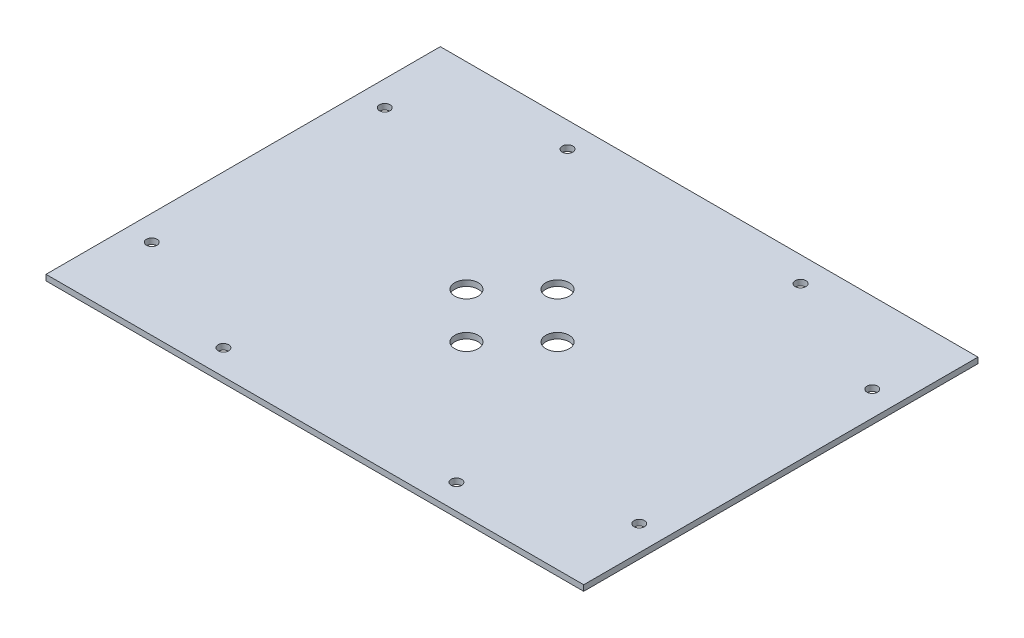
ISO-10303-21;
HEADER;
FILE_DESCRIPTION(('STEP AP214'),'2;1');
FILE_NAME('part.step','',(''),(''),'','','');
FILE_SCHEMA(('AUTOMOTIVE_DESIGN { 1 0 10303 214 1 1 1 1 }'));
ENDSEC;
DATA;
#1=APPLICATION_CONTEXT('core data for automotive mechanical design processes');
#2=APPLICATION_PROTOCOL_DEFINITION('international standard','automotive_design',2000,#1);
#3=PRODUCT_CONTEXT('',#1,'mechanical');
#4=PRODUCT('Part','Part','',(#3));
#5=PRODUCT_RELATED_PRODUCT_CATEGORY('part','',(#4));
#6=PRODUCT_DEFINITION_FORMATION('','',#4);
#7=PRODUCT_DEFINITION_CONTEXT('part definition',#1,'design');
#8=PRODUCT_DEFINITION('design','',#6,#7);
#9=PRODUCT_DEFINITION_SHAPE('','',#8);
#10=(LENGTH_UNIT() NAMED_UNIT(*) SI_UNIT(.MILLI.,.METRE.));
#11=(NAMED_UNIT(*) PLANE_ANGLE_UNIT() SI_UNIT($,.RADIAN.));
#12=(NAMED_UNIT(*) SI_UNIT($,.STERADIAN.) SOLID_ANGLE_UNIT());
#13=UNCERTAINTY_MEASURE_WITH_UNIT(LENGTH_MEASURE(1.E-05),#10,'distance_accuracy_value','');
#14=(GEOMETRIC_REPRESENTATION_CONTEXT(3) GLOBAL_UNCERTAINTY_ASSIGNED_CONTEXT((#13)) GLOBAL_UNIT_ASSIGNED_CONTEXT((#10,
#11,#12)) REPRESENTATION_CONTEXT('',''));
#15=CARTESIAN_POINT('',(0.,0.,0.));
#16=DIRECTION('',(0.,0.,1.));
#17=DIRECTION('',(1.,0.,0.));
#18=AXIS2_PLACEMENT_3D('',#15,#16,#17);
#19=CARTESIAN_POINT('',(75.,1.6,0.));
#20=DIRECTION('',(1.,0.,0.));
#21=DIRECTION('',(0.,0.,-1.));
#22=AXIS2_PLACEMENT_3D('',#19,#20,#21);
#23=PLANE('',#22);
#24=DIRECTION('',(0.,0.,1.));
#25=VECTOR('',#24,1.);
#26=CARTESIAN_POINT('',(75.,0.,0.));
#27=LINE('',#26,#25);
#28=CARTESIAN_POINT('',(75.,0.,-55.));
#29=VERTEX_POINT('',#28);
#30=CARTESIAN_POINT('',(75.,0.,55.));
#31=VERTEX_POINT('',#30);
#32=EDGE_CURVE('E166',#29,#31,#27,.T.);
#33=ORIENTED_EDGE('',*,*,#32,.F.);
#34=DIRECTION('',(0.,-1.,0.));
#35=VECTOR('',#34,1.);
#36=CARTESIAN_POINT('',(75.,1.6,-55.));
#37=LINE('',#36,#35);
#38=CARTESIAN_POINT('',(75.,1.6,-55.));
#39=VERTEX_POINT('',#38);
#40=EDGE_CURVE('E11',#39,#29,#37,.T.);
#41=ORIENTED_EDGE('',*,*,#40,.F.);
#42=DIRECTION('',(0.,0.,1.));
#43=VECTOR('',#42,1.);
#44=CARTESIAN_POINT('',(75.,1.6,0.));
#45=LINE('',#44,#43);
#46=CARTESIAN_POINT('',(75.,1.6,55.));
#47=VERTEX_POINT('',#46);
#48=EDGE_CURVE('E108',#39,#47,#45,.T.);
#49=ORIENTED_EDGE('',*,*,#48,.T.);
#50=DIRECTION('',(0.,-1.,0.));
#51=VECTOR('',#50,1.);
#52=CARTESIAN_POINT('',(75.,1.6,55.));
#53=LINE('',#52,#51);
#54=EDGE_CURVE('E85',#47,#31,#53,.T.);
#55=ORIENTED_EDGE('',*,*,#54,.T.);
#56=EDGE_LOOP('',(#33,#41,#49,#55));
#57=FACE_BOUND('',#56,.T.);
#58=ADVANCED_FACE('F44',(#57),#23,.T.);
#59=CARTESIAN_POINT('',(0.,1.6,-55.));
#60=DIRECTION('',(0.,0.,-1.));
#61=DIRECTION('',(-1.,0.,0.));
#62=AXIS2_PLACEMENT_3D('',#59,#60,#61);
#63=PLANE('',#62);
#64=DIRECTION('',(1.,0.,0.));
#65=VECTOR('',#64,1.);
#66=CARTESIAN_POINT('',(0.,0.,-55.));
#67=LINE('',#66,#65);
#68=CARTESIAN_POINT('',(-75.,0.,-55.));
#69=VERTEX_POINT('',#68);
#70=EDGE_CURVE('E97',#69,#29,#67,.T.);
#71=ORIENTED_EDGE('',*,*,#70,.F.);
#72=DIRECTION('',(0.,-1.,0.));
#73=VECTOR('',#72,1.);
#74=CARTESIAN_POINT('',(-75.,1.6,-55.));
#75=LINE('',#74,#73);
#76=CARTESIAN_POINT('',(-75.,1.6,-55.));
#77=VERTEX_POINT('',#76);
#78=EDGE_CURVE('E54',#77,#69,#75,.T.);
#79=ORIENTED_EDGE('',*,*,#78,.F.);
#80=DIRECTION('',(1.,0.,0.));
#81=VECTOR('',#80,1.);
#82=CARTESIAN_POINT('',(0.,1.6,-55.));
#83=LINE('',#82,#81);
#84=EDGE_CURVE('E95',#77,#39,#83,.T.);
#85=ORIENTED_EDGE('',*,*,#84,.T.);
#86=ORIENTED_EDGE('',*,*,#40,.T.);
#87=EDGE_LOOP('',(#71,#79,#85,#86));
#88=FACE_BOUND('',#87,.T.);
#89=ADVANCED_FACE('F93',(#88),#63,.T.);
#90=CARTESIAN_POINT('',(-75.,1.6,0.));
#91=DIRECTION('',(1.,0.,0.));
#92=DIRECTION('',(0.,0.,-1.));
#93=AXIS2_PLACEMENT_3D('',#90,#91,#92);
#94=PLANE('',#93);
#95=DIRECTION('',(0.,0.,1.));
#96=VECTOR('',#95,1.);
#97=CARTESIAN_POINT('',(-75.,0.,0.));
#98=LINE('',#97,#96);
#99=CARTESIAN_POINT('',(-75.,0.,55.));
#100=VERTEX_POINT('',#99);
#101=EDGE_CURVE('E171',#69,#100,#98,.T.);
#102=ORIENTED_EDGE('',*,*,#101,.T.);
#103=DIRECTION('',(0.,-1.,0.));
#104=VECTOR('',#103,1.);
#105=CARTESIAN_POINT('',(-75.,1.6,55.));
#106=LINE('',#105,#104);
#107=CARTESIAN_POINT('',(-75.,1.6,55.));
#108=VERTEX_POINT('',#107);
#109=EDGE_CURVE('E101',#108,#100,#106,.T.);
#110=ORIENTED_EDGE('',*,*,#109,.F.);
#111=DIRECTION('',(0.,0.,1.));
#112=VECTOR('',#111,1.);
#113=CARTESIAN_POINT('',(-75.,1.6,0.));
#114=LINE('',#113,#112);
#115=EDGE_CURVE('E103',#77,#108,#114,.T.);
#116=ORIENTED_EDGE('',*,*,#115,.F.);
#117=ORIENTED_EDGE('',*,*,#78,.T.);
#118=EDGE_LOOP('',(#102,#110,#116,#117));
#119=FACE_BOUND('',#118,.T.);
#120=ADVANCED_FACE('F104',(#119),#94,.F.);
#121=CARTESIAN_POINT('',(0.,1.6,-12.7));
#122=DIRECTION('',(0.,-1.,0.));
#123=DIRECTION('',(0.,0.,-1.));
#124=AXIS2_PLACEMENT_3D('',#121,#122,#123);
#125=CYLINDRICAL_SURFACE('',#124,3.2639);
#126=CARTESIAN_POINT('',(0.,1.6,-12.7));
#127=DIRECTION('',(0.,1.,0.));
#128=DIRECTION('',(0.,0.,1.));
#129=AXIS2_PLACEMENT_3D('',#126,#127,#128);
#130=CIRCLE('',#129,3.2639);
#131=CARTESIAN_POINT('',(0.,1.6,-9.4361));
#132=VERTEX_POINT('',#131);
#133=EDGE_CURVE('E112',#132,#132,#130,.T.);
#134=ORIENTED_EDGE('',*,*,#133,.T.);
#135=EDGE_LOOP('',(#134));
#136=FACE_BOUND('',#135,.T.);
#137=CARTESIAN_POINT('',(0.,0.,-12.7));
#138=DIRECTION('',(0.,1.,0.));
#139=DIRECTION('',(0.,0.,1.));
#140=AXIS2_PLACEMENT_3D('',#137,#138,#139);
#141=CIRCLE('',#140,3.2639);
#142=CARTESIAN_POINT('',(0.,0.,-9.4361));
#143=VERTEX_POINT('',#142);
#144=EDGE_CURVE('E162',#143,#143,#141,.T.);
#145=ORIENTED_EDGE('',*,*,#144,.F.);
#146=EDGE_LOOP('',(#145));
#147=FACE_BOUND('',#146,.T.);
#148=ADVANCED_FACE('F191',(#136,#147),#125,.F.);
#149=CARTESIAN_POINT('',(12.7,1.6,0.));
#150=DIRECTION('',(0.,-1.,0.));
#151=DIRECTION('',(0.,0.,-1.));
#152=AXIS2_PLACEMENT_3D('',#149,#150,#151);
#153=CYLINDRICAL_SURFACE('',#152,3.2639);
#154=CARTESIAN_POINT('',(12.7,1.6,0.));
#155=DIRECTION('',(0.,1.,0.));
#156=DIRECTION('',(0.,0.,1.));
#157=AXIS2_PLACEMENT_3D('',#154,#155,#156);
#158=CIRCLE('',#157,3.2639);
#159=CARTESIAN_POINT('',(12.7,1.6,3.2639));
#160=VERTEX_POINT('',#159);
#161=EDGE_CURVE('E495',#160,#160,#158,.T.);
#162=ORIENTED_EDGE('',*,*,#161,.T.);
#163=EDGE_LOOP('',(#162));
#164=FACE_BOUND('',#163,.T.);
#165=CARTESIAN_POINT('',(12.7,0.,0.));
#166=DIRECTION('',(0.,1.,0.));
#167=DIRECTION('',(0.,0.,1.));
#168=AXIS2_PLACEMENT_3D('',#165,#166,#167);
#169=CIRCLE('',#168,3.2639);
#170=CARTESIAN_POINT('',(12.7,0.,3.2639));
#171=VERTEX_POINT('',#170);
#172=EDGE_CURVE('E158',#171,#171,#169,.T.);
#173=ORIENTED_EDGE('',*,*,#172,.F.);
#174=EDGE_LOOP('',(#173));
#175=FACE_BOUND('',#174,.T.);
#176=ADVANCED_FACE('F194',(#164,#175),#153,.F.);
#177=CARTESIAN_POINT('',(0.,1.6,12.7));
#178=DIRECTION('',(0.,-1.,0.));
#179=DIRECTION('',(0.,0.,-1.));
#180=AXIS2_PLACEMENT_3D('',#177,#178,#179);
#181=CYLINDRICAL_SURFACE('',#180,3.2639);
#182=CARTESIAN_POINT('',(0.,1.6,12.7));
#183=DIRECTION('',(0.,1.,0.));
#184=DIRECTION('',(0.,0.,1.));
#185=AXIS2_PLACEMENT_3D('',#182,#183,#184);
#186=CIRCLE('',#185,3.2639);
#187=CARTESIAN_POINT('',(0.,1.6,15.9639));
#188=VERTEX_POINT('',#187);
#189=EDGE_CURVE('E491',#188,#188,#186,.T.);
#190=ORIENTED_EDGE('',*,*,#189,.T.);
#191=EDGE_LOOP('',(#190));
#192=FACE_BOUND('',#191,.T.);
#193=CARTESIAN_POINT('',(0.,0.,12.7));
#194=DIRECTION('',(0.,1.,0.));
#195=DIRECTION('',(0.,0.,1.));
#196=AXIS2_PLACEMENT_3D('',#193,#194,#195);
#197=CIRCLE('',#196,3.2639);
#198=CARTESIAN_POINT('',(0.,0.,15.9639));
#199=VERTEX_POINT('',#198);
#200=EDGE_CURVE('E154',#199,#199,#197,.T.);
#201=ORIENTED_EDGE('',*,*,#200,.F.);
#202=EDGE_LOOP('',(#201));
#203=FACE_BOUND('',#202,.T.);
#204=ADVANCED_FACE('F198',(#192,#203),#181,.F.);
#205=CARTESIAN_POINT('',(-12.7,1.6,0.));
#206=DIRECTION('',(0.,-1.,0.));
#207=DIRECTION('',(0.,0.,-1.));
#208=AXIS2_PLACEMENT_3D('',#205,#206,#207);
#209=CYLINDRICAL_SURFACE('',#208,3.2639);
#210=CARTESIAN_POINT('',(-12.7,1.6,0.));
#211=DIRECTION('',(0.,1.,0.));
#212=DIRECTION('',(0.,0.,1.));
#213=AXIS2_PLACEMENT_3D('',#210,#211,#212);
#214=CIRCLE('',#213,3.2639);
#215=CARTESIAN_POINT('',(-12.7,1.6,3.2639));
#216=VERTEX_POINT('',#215);
#217=EDGE_CURVE('E487',#216,#216,#214,.T.);
#218=ORIENTED_EDGE('',*,*,#217,.T.);
#219=EDGE_LOOP('',(#218));
#220=FACE_BOUND('',#219,.T.);
#221=CARTESIAN_POINT('',(-12.7,0.,0.));
#222=DIRECTION('',(0.,1.,0.));
#223=DIRECTION('',(0.,0.,1.));
#224=AXIS2_PLACEMENT_3D('',#221,#222,#223);
#225=CIRCLE('',#224,3.2639);
#226=CARTESIAN_POINT('',(-12.7,0.,3.2639));
#227=VERTEX_POINT('',#226);
#228=EDGE_CURVE('E150',#227,#227,#225,.T.);
#229=ORIENTED_EDGE('',*,*,#228,.F.);
#230=EDGE_LOOP('',(#229));
#231=FACE_BOUND('',#230,.T.);
#232=ADVANCED_FACE('F202',(#220,#231),#209,.F.);
#233=CARTESIAN_POINT('',(-32.5,1.6,-48.));
#234=DIRECTION('',(0.,-1.,0.));
#235=DIRECTION('',(0.,0.,-1.));
#236=AXIS2_PLACEMENT_3D('',#233,#234,#235);
#237=CYLINDRICAL_SURFACE('',#236,1.4732);
#238=CARTESIAN_POINT('',(-32.5,1.6,-48.));
#239=DIRECTION('',(0.,1.,0.));
#240=DIRECTION('',(0.,0.,1.));
#241=AXIS2_PLACEMENT_3D('',#238,#239,#240);
#242=CIRCLE('',#241,1.4732);
#243=CARTESIAN_POINT('',(-32.5,1.6,-46.5268));
#244=VERTEX_POINT('',#243);
#245=EDGE_CURVE('E483',#244,#244,#242,.T.);
#246=ORIENTED_EDGE('',*,*,#245,.T.);
#247=EDGE_LOOP('',(#246));
#248=FACE_BOUND('',#247,.T.);
#249=CARTESIAN_POINT('',(-32.5,0.,-48.));
#250=DIRECTION('',(0.,1.,0.));
#251=DIRECTION('',(0.,0.,1.));
#252=AXIS2_PLACEMENT_3D('',#249,#250,#251);
#253=CIRCLE('',#252,1.4732);
#254=CARTESIAN_POINT('',(-32.5,0.,-46.5268));
#255=VERTEX_POINT('',#254);
#256=EDGE_CURVE('E146',#255,#255,#253,.T.);
#257=ORIENTED_EDGE('',*,*,#256,.F.);
#258=EDGE_LOOP('',(#257));
#259=FACE_BOUND('',#258,.T.);
#260=ADVANCED_FACE('F206',(#248,#259),#237,.F.);
#261=CARTESIAN_POINT('',(32.5,1.6,-48.));
#262=DIRECTION('',(0.,-1.,0.));
#263=DIRECTION('',(0.,0.,-1.));
#264=AXIS2_PLACEMENT_3D('',#261,#262,#263);
#265=CYLINDRICAL_SURFACE('',#264,1.4732);
#266=CARTESIAN_POINT('',(32.5,1.6,-48.));
#267=DIRECTION('',(0.,1.,0.));
#268=DIRECTION('',(0.,0.,1.));
#269=AXIS2_PLACEMENT_3D('',#266,#267,#268);
#270=CIRCLE('',#269,1.4732);
#271=CARTESIAN_POINT('',(32.5,1.6,-46.5268));
#272=VERTEX_POINT('',#271);
#273=EDGE_CURVE('E479',#272,#272,#270,.T.);
#274=ORIENTED_EDGE('',*,*,#273,.T.);
#275=EDGE_LOOP('',(#274));
#276=FACE_BOUND('',#275,.T.);
#277=CARTESIAN_POINT('',(32.5,0.,-48.));
#278=DIRECTION('',(0.,1.,0.));
#279=DIRECTION('',(0.,0.,1.));
#280=AXIS2_PLACEMENT_3D('',#277,#278,#279);
#281=CIRCLE('',#280,1.4732);
#282=CARTESIAN_POINT('',(32.5,0.,-46.5268));
#283=VERTEX_POINT('',#282);
#284=EDGE_CURVE('E142',#283,#283,#281,.T.);
#285=ORIENTED_EDGE('',*,*,#284,.F.);
#286=EDGE_LOOP('',(#285));
#287=FACE_BOUND('',#286,.T.);
#288=ADVANCED_FACE('F210',(#276,#287),#265,.F.);
#289=CARTESIAN_POINT('',(32.5,1.6,48.));
#290=DIRECTION('',(0.,-1.,0.));
#291=DIRECTION('',(0.,0.,-1.));
#292=AXIS2_PLACEMENT_3D('',#289,#290,#291);
#293=CYLINDRICAL_SURFACE('',#292,1.4732);
#294=CARTESIAN_POINT('',(32.5,1.6,48.));
#295=DIRECTION('',(0.,1.,0.));
#296=DIRECTION('',(0.,0.,1.));
#297=AXIS2_PLACEMENT_3D('',#294,#295,#296);
#298=CIRCLE('',#297,1.4732);
#299=CARTESIAN_POINT('',(32.5,1.6,49.4732));
#300=VERTEX_POINT('',#299);
#301=EDGE_CURVE('E475',#300,#300,#298,.T.);
#302=ORIENTED_EDGE('',*,*,#301,.T.);
#303=EDGE_LOOP('',(#302));
#304=FACE_BOUND('',#303,.T.);
#305=CARTESIAN_POINT('',(32.5,0.,48.));
#306=DIRECTION('',(0.,1.,0.));
#307=DIRECTION('',(0.,0.,1.));
#308=AXIS2_PLACEMENT_3D('',#305,#306,#307);
#309=CIRCLE('',#308,1.4732);
#310=CARTESIAN_POINT('',(32.5,0.,49.4732));
#311=VERTEX_POINT('',#310);
#312=EDGE_CURVE('E138',#311,#311,#309,.T.);
#313=ORIENTED_EDGE('',*,*,#312,.F.);
#314=EDGE_LOOP('',(#313));
#315=FACE_BOUND('',#314,.T.);
#316=ADVANCED_FACE('F214',(#304,#315),#293,.F.);
#317=CARTESIAN_POINT('',(-32.5,1.6,48.));
#318=DIRECTION('',(0.,-1.,0.));
#319=DIRECTION('',(0.,0.,-1.));
#320=AXIS2_PLACEMENT_3D('',#317,#318,#319);
#321=CYLINDRICAL_SURFACE('',#320,1.4732);
#322=CARTESIAN_POINT('',(-32.5,1.6,48.));
#323=DIRECTION('',(0.,1.,0.));
#324=DIRECTION('',(0.,0.,1.));
#325=AXIS2_PLACEMENT_3D('',#322,#323,#324);
#326=CIRCLE('',#325,1.4732);
#327=CARTESIAN_POINT('',(-32.5,1.6,49.4732));
#328=VERTEX_POINT('',#327);
#329=EDGE_CURVE('E471',#328,#328,#326,.T.);
#330=ORIENTED_EDGE('',*,*,#329,.T.);
#331=EDGE_LOOP('',(#330));
#332=FACE_BOUND('',#331,.T.);
#333=CARTESIAN_POINT('',(-32.5,0.,48.));
#334=DIRECTION('',(0.,1.,0.));
#335=DIRECTION('',(0.,0.,1.));
#336=AXIS2_PLACEMENT_3D('',#333,#334,#335);
#337=CIRCLE('',#336,1.4732);
#338=CARTESIAN_POINT('',(-32.5,0.,49.4732));
#339=VERTEX_POINT('',#338);
#340=EDGE_CURVE('E134',#339,#339,#337,.T.);
#341=ORIENTED_EDGE('',*,*,#340,.F.);
#342=EDGE_LOOP('',(#341));
#343=FACE_BOUND('',#342,.T.);
#344=ADVANCED_FACE('F218',(#332,#343),#321,.F.);
#345=CARTESIAN_POINT('',(-68.,1.6,-32.5));
#346=DIRECTION('',(0.,-1.,0.));
#347=DIRECTION('',(0.,0.,-1.));
#348=AXIS2_PLACEMENT_3D('',#345,#346,#347);
#349=CYLINDRICAL_SURFACE('',#348,1.4732);
#350=CARTESIAN_POINT('',(-68.,1.6,-32.5));
#351=DIRECTION('',(0.,1.,0.));
#352=DIRECTION('',(0.,0.,1.));
#353=AXIS2_PLACEMENT_3D('',#350,#351,#352);
#354=CIRCLE('',#353,1.4732);
#355=CARTESIAN_POINT('',(-68.,1.6,-31.0268));
#356=VERTEX_POINT('',#355);
#357=EDGE_CURVE('E467',#356,#356,#354,.T.);
#358=ORIENTED_EDGE('',*,*,#357,.T.);
#359=EDGE_LOOP('',(#358));
#360=FACE_BOUND('',#359,.T.);
#361=CARTESIAN_POINT('',(-68.,0.,-32.5));
#362=DIRECTION('',(0.,1.,0.));
#363=DIRECTION('',(0.,0.,1.));
#364=AXIS2_PLACEMENT_3D('',#361,#362,#363);
#365=CIRCLE('',#364,1.4732);
#366=CARTESIAN_POINT('',(-68.,0.,-31.0268));
#367=VERTEX_POINT('',#366);
#368=EDGE_CURVE('E130',#367,#367,#365,.T.);
#369=ORIENTED_EDGE('',*,*,#368,.F.);
#370=EDGE_LOOP('',(#369));
#371=FACE_BOUND('',#370,.T.);
#372=ADVANCED_FACE('F222',(#360,#371),#349,.F.);
#373=CARTESIAN_POINT('',(68.,1.6,-32.5));
#374=DIRECTION('',(0.,-1.,0.));
#375=DIRECTION('',(0.,0.,-1.));
#376=AXIS2_PLACEMENT_3D('',#373,#374,#375);
#377=CYLINDRICAL_SURFACE('',#376,1.4732);
#378=CARTESIAN_POINT('',(68.,1.6,-32.5));
#379=DIRECTION('',(0.,1.,0.));
#380=DIRECTION('',(0.,0.,1.));
#381=AXIS2_PLACEMENT_3D('',#378,#379,#380);
#382=CIRCLE('',#381,1.4732);
#383=CARTESIAN_POINT('',(68.,1.6,-31.0268));
#384=VERTEX_POINT('',#383);
#385=EDGE_CURVE('E463',#384,#384,#382,.T.);
#386=ORIENTED_EDGE('',*,*,#385,.T.);
#387=EDGE_LOOP('',(#386));
#388=FACE_BOUND('',#387,.T.);
#389=CARTESIAN_POINT('',(68.,0.,-32.5));
#390=DIRECTION('',(0.,1.,0.));
#391=DIRECTION('',(0.,0.,1.));
#392=AXIS2_PLACEMENT_3D('',#389,#390,#391);
#393=CIRCLE('',#392,1.4732);
#394=CARTESIAN_POINT('',(68.,0.,-31.0268));
#395=VERTEX_POINT('',#394);
#396=EDGE_CURVE('E126',#395,#395,#393,.T.);
#397=ORIENTED_EDGE('',*,*,#396,.F.);
#398=EDGE_LOOP('',(#397));
#399=FACE_BOUND('',#398,.T.);
#400=ADVANCED_FACE('F226',(#388,#399),#377,.F.);
#401=CARTESIAN_POINT('',(68.,1.6,32.5));
#402=DIRECTION('',(0.,-1.,0.));
#403=DIRECTION('',(0.,0.,-1.));
#404=AXIS2_PLACEMENT_3D('',#401,#402,#403);
#405=CYLINDRICAL_SURFACE('',#404,1.4732);
#406=CARTESIAN_POINT('',(68.,1.6,32.5));
#407=DIRECTION('',(0.,1.,0.));
#408=DIRECTION('',(0.,0.,1.));
#409=AXIS2_PLACEMENT_3D('',#406,#407,#408);
#410=CIRCLE('',#409,1.4732);
#411=CARTESIAN_POINT('',(68.,1.6,33.9732));
#412=VERTEX_POINT('',#411);
#413=EDGE_CURVE('E240',#412,#412,#410,.T.);
#414=ORIENTED_EDGE('',*,*,#413,.T.);
#415=EDGE_LOOP('',(#414));
#416=FACE_BOUND('',#415,.T.);
#417=CARTESIAN_POINT('',(68.,0.,32.5));
#418=DIRECTION('',(0.,1.,0.));
#419=DIRECTION('',(0.,0.,1.));
#420=AXIS2_PLACEMENT_3D('',#417,#418,#419);
#421=CIRCLE('',#420,1.4732);
#422=CARTESIAN_POINT('',(68.,0.,33.9732));
#423=VERTEX_POINT('',#422);
#424=EDGE_CURVE('E122',#423,#423,#421,.T.);
#425=ORIENTED_EDGE('',*,*,#424,.F.);
#426=EDGE_LOOP('',(#425));
#427=FACE_BOUND('',#426,.T.);
#428=ADVANCED_FACE('F229',(#416,#427),#405,.F.);
#429=CARTESIAN_POINT('',(-68.,1.6,32.5));
#430=DIRECTION('',(0.,-1.,0.));
#431=DIRECTION('',(0.,0.,-1.));
#432=AXIS2_PLACEMENT_3D('',#429,#430,#431);
#433=CYLINDRICAL_SURFACE('',#432,1.4732);
#434=CARTESIAN_POINT('',(-68.,1.6,32.5));
#435=DIRECTION('',(0.,1.,0.));
#436=DIRECTION('',(0.,0.,1.));
#437=AXIS2_PLACEMENT_3D('',#434,#435,#436);
#438=CIRCLE('',#437,1.4732);
#439=CARTESIAN_POINT('',(-68.,1.6,33.9732));
#440=VERTEX_POINT('',#439);
#441=EDGE_CURVE('E176',#440,#440,#438,.T.);
#442=ORIENTED_EDGE('',*,*,#441,.T.);
#443=EDGE_LOOP('',(#442));
#444=FACE_BOUND('',#443,.T.);
#445=CARTESIAN_POINT('',(-68.,0.,32.5));
#446=DIRECTION('',(0.,1.,0.));
#447=DIRECTION('',(0.,0.,1.));
#448=AXIS2_PLACEMENT_3D('',#445,#446,#447);
#449=CIRCLE('',#448,1.4732);
#450=CARTESIAN_POINT('',(-68.,0.,33.9732));
#451=VERTEX_POINT('',#450);
#452=EDGE_CURVE('E118',#451,#451,#449,.T.);
#453=ORIENTED_EDGE('',*,*,#452,.F.);
#454=EDGE_LOOP('',(#453));
#455=FACE_BOUND('',#454,.T.);
#456=ADVANCED_FACE('F46',(#444,#455),#433,.F.);
#457=CARTESIAN_POINT('',(0.,1.6,55.));
#458=DIRECTION('',(0.,0.,-1.));
#459=DIRECTION('',(-1.,0.,0.));
#460=AXIS2_PLACEMENT_3D('',#457,#458,#459);
#461=PLANE('',#460);
#462=DIRECTION('',(1.,0.,0.));
#463=VECTOR('',#462,1.);
#464=CARTESIAN_POINT('',(0.,0.,55.));
#465=LINE('',#464,#463);
#466=EDGE_CURVE('E78',#100,#31,#465,.T.);
#467=ORIENTED_EDGE('',*,*,#466,.T.);
#468=ORIENTED_EDGE('',*,*,#54,.F.);
#469=DIRECTION('',(1.,0.,0.));
#470=VECTOR('',#469,1.);
#471=CARTESIAN_POINT('',(0.,1.6,55.));
#472=LINE('',#471,#470);
#473=EDGE_CURVE('E62',#108,#47,#472,.T.);
#474=ORIENTED_EDGE('',*,*,#473,.F.);
#475=ORIENTED_EDGE('',*,*,#109,.T.);
#476=EDGE_LOOP('',(#467,#468,#474,#475));
#477=FACE_BOUND('',#476,.T.);
#478=ADVANCED_FACE('F181',(#477),#461,.F.);
#479=CARTESIAN_POINT('',(0.,1.6,0.));
#480=DIRECTION('',(0.,1.,0.));
#481=DIRECTION('',(0.,0.,1.));
#482=AXIS2_PLACEMENT_3D('',#479,#480,#481);
#483=PLANE('',#482);
#484=ORIENTED_EDGE('',*,*,#441,.F.);
#485=EDGE_LOOP('',(#484));
#486=FACE_BOUND('',#485,.T.);
#487=ORIENTED_EDGE('',*,*,#413,.F.);
#488=EDGE_LOOP('',(#487));
#489=FACE_BOUND('',#488,.T.);
#490=ORIENTED_EDGE('',*,*,#385,.F.);
#491=EDGE_LOOP('',(#490));
#492=FACE_BOUND('',#491,.T.);
#493=ORIENTED_EDGE('',*,*,#357,.F.);
#494=EDGE_LOOP('',(#493));
#495=FACE_BOUND('',#494,.T.);
#496=ORIENTED_EDGE('',*,*,#329,.F.);
#497=EDGE_LOOP('',(#496));
#498=FACE_BOUND('',#497,.T.);
#499=ORIENTED_EDGE('',*,*,#301,.F.);
#500=EDGE_LOOP('',(#499));
#501=FACE_BOUND('',#500,.T.);
#502=ORIENTED_EDGE('',*,*,#273,.F.);
#503=EDGE_LOOP('',(#502));
#504=FACE_BOUND('',#503,.T.);
#505=ORIENTED_EDGE('',*,*,#245,.F.);
#506=EDGE_LOOP('',(#505));
#507=FACE_BOUND('',#506,.T.);
#508=ORIENTED_EDGE('',*,*,#217,.F.);
#509=EDGE_LOOP('',(#508));
#510=FACE_BOUND('',#509,.T.);
#511=ORIENTED_EDGE('',*,*,#189,.F.);
#512=EDGE_LOOP('',(#511));
#513=FACE_BOUND('',#512,.T.);
#514=ORIENTED_EDGE('',*,*,#161,.F.);
#515=EDGE_LOOP('',(#514));
#516=FACE_BOUND('',#515,.T.);
#517=ORIENTED_EDGE('',*,*,#133,.F.);
#518=EDGE_LOOP('',(#517));
#519=FACE_BOUND('',#518,.T.);
#520=ORIENTED_EDGE('',*,*,#48,.F.);
#521=ORIENTED_EDGE('',*,*,#84,.F.);
#522=ORIENTED_EDGE('',*,*,#115,.T.);
#523=ORIENTED_EDGE('',*,*,#473,.T.);
#524=EDGE_LOOP('',(#520,#521,#522,#523));
#525=FACE_BOUND('',#524,.T.);
#526=ADVANCED_FACE('F107',(#486,#489,#492,#495,#498,#501,#504,#507,#510,#513,#516,#519,#525),
#483,.T.);
#527=CARTESIAN_POINT('',(0.,0.,0.));
#528=DIRECTION('',(0.,1.,0.));
#529=DIRECTION('',(0.,0.,1.));
#530=AXIS2_PLACEMENT_3D('',#527,#528,#529);
#531=PLANE('',#530);
#532=ORIENTED_EDGE('',*,*,#452,.T.);
#533=EDGE_LOOP('',(#532));
#534=FACE_BOUND('',#533,.T.);
#535=ORIENTED_EDGE('',*,*,#424,.T.);
#536=EDGE_LOOP('',(#535));
#537=FACE_BOUND('',#536,.T.);
#538=ORIENTED_EDGE('',*,*,#396,.T.);
#539=EDGE_LOOP('',(#538));
#540=FACE_BOUND('',#539,.T.);
#541=ORIENTED_EDGE('',*,*,#368,.T.);
#542=EDGE_LOOP('',(#541));
#543=FACE_BOUND('',#542,.T.);
#544=ORIENTED_EDGE('',*,*,#340,.T.);
#545=EDGE_LOOP('',(#544));
#546=FACE_BOUND('',#545,.T.);
#547=ORIENTED_EDGE('',*,*,#312,.T.);
#548=EDGE_LOOP('',(#547));
#549=FACE_BOUND('',#548,.T.);
#550=ORIENTED_EDGE('',*,*,#284,.T.);
#551=EDGE_LOOP('',(#550));
#552=FACE_BOUND('',#551,.T.);
#553=ORIENTED_EDGE('',*,*,#256,.T.);
#554=EDGE_LOOP('',(#553));
#555=FACE_BOUND('',#554,.T.);
#556=ORIENTED_EDGE('',*,*,#228,.T.);
#557=EDGE_LOOP('',(#556));
#558=FACE_BOUND('',#557,.T.);
#559=ORIENTED_EDGE('',*,*,#200,.T.);
#560=EDGE_LOOP('',(#559));
#561=FACE_BOUND('',#560,.T.);
#562=ORIENTED_EDGE('',*,*,#172,.T.);
#563=EDGE_LOOP('',(#562));
#564=FACE_BOUND('',#563,.T.);
#565=ORIENTED_EDGE('',*,*,#144,.T.);
#566=EDGE_LOOP('',(#565));
#567=FACE_BOUND('',#566,.T.);
#568=ORIENTED_EDGE('',*,*,#32,.T.);
#569=ORIENTED_EDGE('',*,*,#466,.F.);
#570=ORIENTED_EDGE('',*,*,#101,.F.);
#571=ORIENTED_EDGE('',*,*,#70,.T.);
#572=EDGE_LOOP('',(#568,#569,#570,#571));
#573=FACE_BOUND('',#572,.T.);
#574=ADVANCED_FACE('F182',(#534,#537,#540,#543,#546,#549,#552,#555,#558,#561,#564,#567,#573),
#531,.F.);
#575=CLOSED_SHELL('',(#58,#89,#120,#148,#176,#204,#232,#260,#288,#316,#344,#372,#400,#428,#456,
#478,#526,#574));
#576=MANIFOLD_SOLID_BREP('B2',#575);
#577=ADVANCED_BREP_SHAPE_REPRESENTATION('',(#18,#576),#14);
#578=SHAPE_DEFINITION_REPRESENTATION(#9,#577);
ENDSEC;
END-ISO-10303-21;
